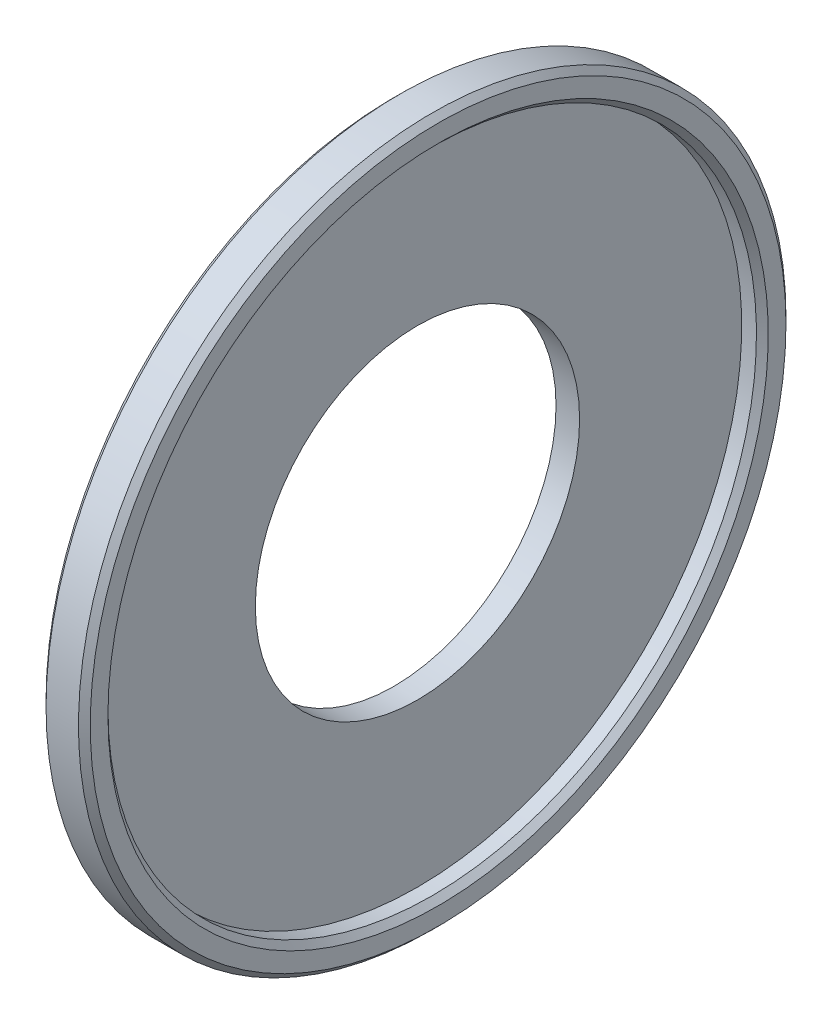
ISO-10303-21;
HEADER;
FILE_DESCRIPTION(('STEP AP214'),'2;1');
FILE_NAME('part.step','',(''),(''),'','','');
FILE_SCHEMA(('AUTOMOTIVE_DESIGN { 1 0 10303 214 1 1 1 1 }'));
ENDSEC;
DATA;
#1=APPLICATION_CONTEXT('core data for automotive mechanical design processes');
#2=APPLICATION_PROTOCOL_DEFINITION('international standard','automotive_design',2000,#1);
#3=PRODUCT_CONTEXT('',#1,'mechanical');
#4=PRODUCT('Part','Part','',(#3));
#5=PRODUCT_RELATED_PRODUCT_CATEGORY('part','',(#4));
#6=PRODUCT_DEFINITION_FORMATION('','',#4);
#7=PRODUCT_DEFINITION_CONTEXT('part definition',#1,'design');
#8=PRODUCT_DEFINITION('design','',#6,#7);
#9=PRODUCT_DEFINITION_SHAPE('','',#8);
#10=(LENGTH_UNIT() NAMED_UNIT(*) SI_UNIT(.MILLI.,.METRE.));
#11=(NAMED_UNIT(*) PLANE_ANGLE_UNIT() SI_UNIT($,.RADIAN.));
#12=(NAMED_UNIT(*) SI_UNIT($,.STERADIAN.) SOLID_ANGLE_UNIT());
#13=UNCERTAINTY_MEASURE_WITH_UNIT(LENGTH_MEASURE(1.E-05),#10,'distance_accuracy_value','');
#14=(GEOMETRIC_REPRESENTATION_CONTEXT(3) GLOBAL_UNCERTAINTY_ASSIGNED_CONTEXT((#13)) GLOBAL_UNIT_ASSIGNED_CONTEXT((#10,
#11,#12)) REPRESENTATION_CONTEXT('',''));
#15=CARTESIAN_POINT('',(0.,0.,0.));
#16=DIRECTION('',(0.,0.,1.));
#17=DIRECTION('',(1.,0.,0.));
#18=AXIS2_PLACEMENT_3D('',#15,#16,#17);
#19=CARTESIAN_POINT('',(-29.7,146.,-1.13216233483727E-12));
#20=DIRECTION('',(1.,0.,0.));
#21=DIRECTION('',(0.,1.,0.));
#22=AXIS2_PLACEMENT_3D('',#19,#20,#21);
#23=PLANE('',#22);
#24=CARTESIAN_POINT('',(-29.7,146.,-1.13163970614945E-12));
#25=DIRECTION('',(-1.,0.,0.));
#26=DIRECTION('',(0.,1.,0.));
#27=AXIS2_PLACEMENT_3D('',#24,#25,#26);
#28=CIRCLE('',#27,5.5);
#29=CARTESIAN_POINT('',(-29.7,140.5,-1.13231326188899E-12));
#30=VERTEX_POINT('',#29);
#31=EDGE_CURVE('E11',#30,#30,#28,.T.);
#32=ORIENTED_EDGE('',*,*,#31,.T.);
#33=EDGE_LOOP('',(#32));
#34=FACE_BOUND('',#33,.T.);
#35=CARTESIAN_POINT('',(-29.7,146.,-1.13216233483727E-12));
#36=DIRECTION('',(1.,0.,0.));
#37=DIRECTION('',(0.,1.,0.));
#38=AXIS2_PLACEMENT_3D('',#35,#36,#37);
#39=CIRCLE('',#38,11.);
#40=CARTESIAN_POINT('',(-29.7,135.,-1.13350944631633E-12));
#41=VERTEX_POINT('',#40);
#42=EDGE_CURVE('E122',#41,#41,#39,.T.);
#43=ORIENTED_EDGE('',*,*,#42,.T.);
#44=EDGE_LOOP('',(#43));
#45=FACE_BOUND('',#44,.T.);
#46=ADVANCED_FACE('F17',(#34,#45),#23,.T.);
#47=CARTESIAN_POINT('',(-29.,146.,-1.13170688004116E-12));
#48=DIRECTION('',(1.,0.,0.));
#49=DIRECTION('',(0.,1.,0.));
#50=AXIS2_PLACEMENT_3D('',#47,#48,#49);
#51=PLANE('',#50);
#52=CARTESIAN_POINT('',(-29.,146.,-1.13222950872897E-12));
#53=DIRECTION('',(-1.,0.,0.));
#54=DIRECTION('',(0.,1.,0.));
#55=AXIS2_PLACEMENT_3D('',#52,#53,#54);
#56=CIRCLE('',#55,11.2);
#57=CARTESIAN_POINT('',(-29.,146.,11.1999999999989));
#58=VERTEX_POINT('',#57);
#59=EDGE_CURVE('E84',#58,#58,#56,.T.);
#60=ORIENTED_EDGE('',*,*,#59,.T.);
#61=EDGE_LOOP('',(#60));
#62=FACE_BOUND('',#61,.T.);
#63=CARTESIAN_POINT('',(-29.,146.,-1.13170688004116E-12));
#64=DIRECTION('',(1.,0.,0.));
#65=DIRECTION('',(0.,1.,0.));
#66=AXIS2_PLACEMENT_3D('',#63,#64,#65);
#67=CIRCLE('',#66,11.8);
#68=CARTESIAN_POINT('',(-29.,146.,-11.8000000000011));
#69=VERTEX_POINT('',#68);
#70=EDGE_CURVE('E127',#69,#69,#67,.T.);
#71=ORIENTED_EDGE('',*,*,#70,.T.);
#72=EDGE_LOOP('',(#71));
#73=FACE_BOUND('',#72,.T.);
#74=ADVANCED_FACE('F156',(#62,#73),#51,.T.);
#75=CARTESIAN_POINT('',(-30.5,146.,-1.13156293598751E-12));
#76=DIRECTION('',(1.,0.,0.));
#77=DIRECTION('',(0.,1.,0.));
#78=AXIS2_PLACEMENT_3D('',#75,#76,#77);
#79=PLANE('',#78);
#80=CARTESIAN_POINT('',(-30.5,146.,-1.13156293598751E-12));
#81=DIRECTION('',(1.,0.,0.));
#82=DIRECTION('',(0.,1.,0.));
#83=AXIS2_PLACEMENT_3D('',#80,#81,#82);
#84=CIRCLE('',#83,5.5);
#85=CARTESIAN_POINT('',(-30.5,140.5,-1.13223649172704E-12));
#86=VERTEX_POINT('',#85);
#87=EDGE_CURVE('E133',#86,#86,#84,.T.);
#88=ORIENTED_EDGE('',*,*,#87,.T.);
#89=EDGE_LOOP('',(#88));
#90=FACE_BOUND('',#89,.T.);
#91=CARTESIAN_POINT('',(-30.5,146.,-1.13156293598751E-12));
#92=DIRECTION('',(-1.,0.,0.));
#93=DIRECTION('',(0.,1.,0.));
#94=AXIS2_PLACEMENT_3D('',#91,#92,#93);
#95=CIRCLE('',#94,11.8);
#96=CARTESIAN_POINT('',(-30.5,146.,11.7999999999989));
#97=VERTEX_POINT('',#96);
#98=EDGE_CURVE('E96',#97,#97,#95,.T.);
#99=ORIENTED_EDGE('',*,*,#98,.T.);
#100=EDGE_LOOP('',(#99));
#101=FACE_BOUND('',#100,.T.);
#102=ADVANCED_FACE('F97',(#90,#101),#79,.F.);
#103=CARTESIAN_POINT('',(-30.5,146.,-1.13156293598751E-12));
#104=DIRECTION('',(1.,0.,0.));
#105=DIRECTION('',(0.,1.,0.));
#106=AXIS2_PLACEMENT_3D('',#103,#104,#105);
#107=CYLINDRICAL_SURFACE('',#106,5.5);
#108=ORIENTED_EDGE('',*,*,#87,.F.);
#109=DIRECTION('',(1.,0.,0.));
#110=VECTOR('',#109,1.);
#111=CARTESIAN_POINT('',(-30.5,140.5,-1.13223649172704E-12));
#112=LINE('',#111,#110);
#113=EDGE_CURVE('E27',#86,#30,#112,.T.);
#114=ORIENTED_EDGE('',*,*,#113,.T.);
#115=ORIENTED_EDGE('',*,*,#31,.F.);
#116=ORIENTED_EDGE('',*,*,#113,.F.);
#117=EDGE_LOOP('',(#108,#114,#115,#116));
#118=FACE_BOUND('',#117,.T.);
#119=ADVANCED_FACE('F153',(#118),#107,.F.);
#120=CARTESIAN_POINT('',(-30.5,146.,-1.13156293598751E-12));
#121=DIRECTION('',(1.,0.,0.));
#122=DIRECTION('',(0.,1.,0.));
#123=AXIS2_PLACEMENT_3D('',#120,#121,#122);
#124=CYLINDRICAL_SURFACE('',#123,12.);
#125=CARTESIAN_POINT('',(-29.2,146.,-1.13168768750067E-12));
#126=DIRECTION('',(-1.,0.,0.));
#127=DIRECTION('',(0.,0.,-1.));
#128=AXIS2_PLACEMENT_3D('',#125,#126,#127);
#129=CIRCLE('',#128,12.);
#130=CARTESIAN_POINT('',(-29.2,134.,-1.13315726365965E-12));
#131=VERTEX_POINT('',#130);
#132=CARTESIAN_POINT('',(-29.2,146.,-12.0000000000011));
#133=VERTEX_POINT('',#132);
#134=EDGE_CURVE('E138',#131,#133,#129,.T.);
#135=ORIENTED_EDGE('',*,*,#134,.T.);
#136=CARTESIAN_POINT('',(-29.2,146.,-1.13168768750067E-12));
#137=DIRECTION('',(-1.,0.,0.));
#138=DIRECTION('',(0.,0.,-1.));
#139=AXIS2_PLACEMENT_3D('',#136,#137,#138);
#140=CIRCLE('',#139,12.);
#141=EDGE_CURVE('E128',#133,#131,#140,.T.);
#142=ORIENTED_EDGE('',*,*,#141,.T.);
#143=DIRECTION('',(-1.,0.,0.));
#144=VECTOR('',#143,1.);
#145=CARTESIAN_POINT('',(-30.5,134.,-1.13303251214649E-12));
#146=LINE('',#145,#144);
#147=CARTESIAN_POINT('',(-30.3,134.,-1.13305170468697E-12));
#148=VERTEX_POINT('',#147);
#149=EDGE_CURVE('E21',#131,#148,#146,.T.);
#150=ORIENTED_EDGE('',*,*,#149,.T.);
#151=CARTESIAN_POINT('',(-30.3,146.,-1.13158212852799E-12));
#152=DIRECTION('',(1.,0.,0.));
#153=DIRECTION('',(0.,0.,-1.));
#154=AXIS2_PLACEMENT_3D('',#151,#152,#153);
#155=CIRCLE('',#154,12.);
#156=CARTESIAN_POINT('',(-30.3,146.,11.9999999999989));
#157=VERTEX_POINT('',#156);
#158=EDGE_CURVE('E115',#148,#157,#155,.T.);
#159=ORIENTED_EDGE('',*,*,#158,.T.);
#160=CARTESIAN_POINT('',(-30.3,146.,-1.13158212852799E-12));
#161=DIRECTION('',(1.,0.,0.));
#162=DIRECTION('',(0.,0.,-1.));
#163=AXIS2_PLACEMENT_3D('',#160,#161,#162);
#164=CIRCLE('',#163,12.);
#165=EDGE_CURVE('E111',#157,#148,#164,.T.);
#166=ORIENTED_EDGE('',*,*,#165,.T.);
#167=ORIENTED_EDGE('',*,*,#149,.F.);
#168=EDGE_LOOP('',(#135,#142,#150,#159,#166,#167));
#169=FACE_BOUND('',#168,.T.);
#170=ADVANCED_FACE('F163',(#169),#124,.T.);
#171=CARTESIAN_POINT('',(-29.7,146.,-1.13216233483727E-12));
#172=DIRECTION('',(1.,0.,0.));
#173=DIRECTION('',(0.,1.,0.));
#174=AXIS2_PLACEMENT_3D('',#171,#172,#173);
#175=CYLINDRICAL_SURFACE('',#174,11.);
#176=ORIENTED_EDGE('',*,*,#42,.F.);
#177=DIRECTION('',(1.,0.,0.));
#178=VECTOR('',#177,1.);
#179=CARTESIAN_POINT('',(-29.7,135.,-1.13350944631633E-12));
#180=LINE('',#179,#178);
#181=CARTESIAN_POINT('',(-29.2,135.,-1.13355742766754E-12));
#182=VERTEX_POINT('',#181);
#183=EDGE_CURVE('E119',#41,#182,#180,.T.);
#184=ORIENTED_EDGE('',*,*,#183,.T.);
#185=CARTESIAN_POINT('',(-29.2,146.,-1.13221031618848E-12));
#186=DIRECTION('',(1.,0.,0.));
#187=DIRECTION('',(0.,0.,-1.));
#188=AXIS2_PLACEMENT_3D('',#185,#186,#187);
#189=CIRCLE('',#188,11.);
#190=CARTESIAN_POINT('',(-29.2,146.,10.9999999999989));
#191=VERTEX_POINT('',#190);
#192=EDGE_CURVE('E101',#182,#191,#189,.T.);
#193=ORIENTED_EDGE('',*,*,#192,.T.);
#194=CARTESIAN_POINT('',(-29.2,146.,-1.13221031618848E-12));
#195=DIRECTION('',(1.,0.,0.));
#196=DIRECTION('',(0.,0.,-1.));
#197=AXIS2_PLACEMENT_3D('',#194,#195,#196);
#198=CIRCLE('',#197,11.);
#199=EDGE_CURVE('E108',#191,#182,#198,.T.);
#200=ORIENTED_EDGE('',*,*,#199,.T.);
#201=ORIENTED_EDGE('',*,*,#183,.F.);
#202=EDGE_LOOP('',(#176,#184,#193,#200,#201));
#203=FACE_BOUND('',#202,.T.);
#204=ADVANCED_FACE('F176',(#203),#175,.F.);
#205=CARTESIAN_POINT('',(-29.,146.,-1.13170688004116E-12));
#206=DIRECTION('',(-1.,0.,0.));
#207=DIRECTION('',(0.,0.,1.));
#208=AXIS2_PLACEMENT_3D('',#205,#206,#207);
#209=CONICAL_SURFACE('',#208,11.8,0.785398163397474);
#210=ORIENTED_EDGE('',*,*,#134,.F.);
#211=ORIENTED_EDGE('',*,*,#141,.F.);
#212=DIRECTION('',(0.707106781186529,0.,0.707106781186566));
#213=VECTOR('',#212,1.);
#214=CARTESIAN_POINT('',(-29.,146.,-11.8000000000011));
#215=LINE('',#214,#213);
#216=EDGE_CURVE('E123',#133,#69,#215,.T.);
#217=ORIENTED_EDGE('',*,*,#216,.T.);
#218=ORIENTED_EDGE('',*,*,#70,.F.);
#219=ORIENTED_EDGE('',*,*,#216,.F.);
#220=EDGE_LOOP('',(#210,#211,#217,#218,#219));
#221=FACE_BOUND('',#220,.T.);
#222=ADVANCED_FACE('F174',(#221),#209,.T.);
#223=CARTESIAN_POINT('',(-29.2,146.,-1.13221031618848E-12));
#224=DIRECTION('',(1.,0.,0.));
#225=DIRECTION('',(0.,0.,-1.));
#226=AXIS2_PLACEMENT_3D('',#223,#224,#225);
#227=CONICAL_SURFACE('',#226,11.,0.785398163397431);
#228=ORIENTED_EDGE('',*,*,#192,.F.);
#229=ORIENTED_EDGE('',*,*,#199,.F.);
#230=DIRECTION('',(0.70710678118656,0.,0.707106781186535));
#231=VECTOR('',#230,1.);
#232=CARTESIAN_POINT('',(-29.2,146.,10.9999999999989));
#233=LINE('',#232,#231);
#234=EDGE_CURVE('E132',#191,#58,#233,.T.);
#235=ORIENTED_EDGE('',*,*,#234,.T.);
#236=ORIENTED_EDGE('',*,*,#59,.F.);
#237=ORIENTED_EDGE('',*,*,#234,.F.);
#238=EDGE_LOOP('',(#228,#229,#235,#236,#237));
#239=FACE_BOUND('',#238,.T.);
#240=ADVANCED_FACE('F19',(#239),#227,.F.);
#241=CARTESIAN_POINT('',(-30.3,146.,-1.13158212852799E-12));
#242=DIRECTION('',(1.,0.,0.));
#243=DIRECTION('',(0.,0.,-1.));
#244=AXIS2_PLACEMENT_3D('',#241,#242,#243);
#245=CONICAL_SURFACE('',#244,12.,0.785398163397431);
#246=ORIENTED_EDGE('',*,*,#158,.F.);
#247=ORIENTED_EDGE('',*,*,#165,.F.);
#248=DIRECTION('',(-0.70710678118656,0.,-0.707106781186535));
#249=VECTOR('',#248,1.);
#250=CARTESIAN_POINT('',(-30.3,146.,11.9999999999989));
#251=LINE('',#250,#249);
#252=EDGE_CURVE('E102',#157,#97,#251,.T.);
#253=ORIENTED_EDGE('',*,*,#252,.T.);
#254=ORIENTED_EDGE('',*,*,#98,.F.);
#255=ORIENTED_EDGE('',*,*,#252,.F.);
#256=EDGE_LOOP('',(#246,#247,#253,#254,#255));
#257=FACE_BOUND('',#256,.T.);
#258=ADVANCED_FACE('F182',(#257),#245,.T.);
#259=CLOSED_SHELL('',(#46,#74,#102,#119,#170,#204,#222,#240,#258));
#260=MANIFOLD_SOLID_BREP('B1',#259);
#261=ADVANCED_BREP_SHAPE_REPRESENTATION('',(#18,#260),#14);
#262=SHAPE_DEFINITION_REPRESENTATION(#9,#261);
ENDSEC;
END-ISO-10303-21;
